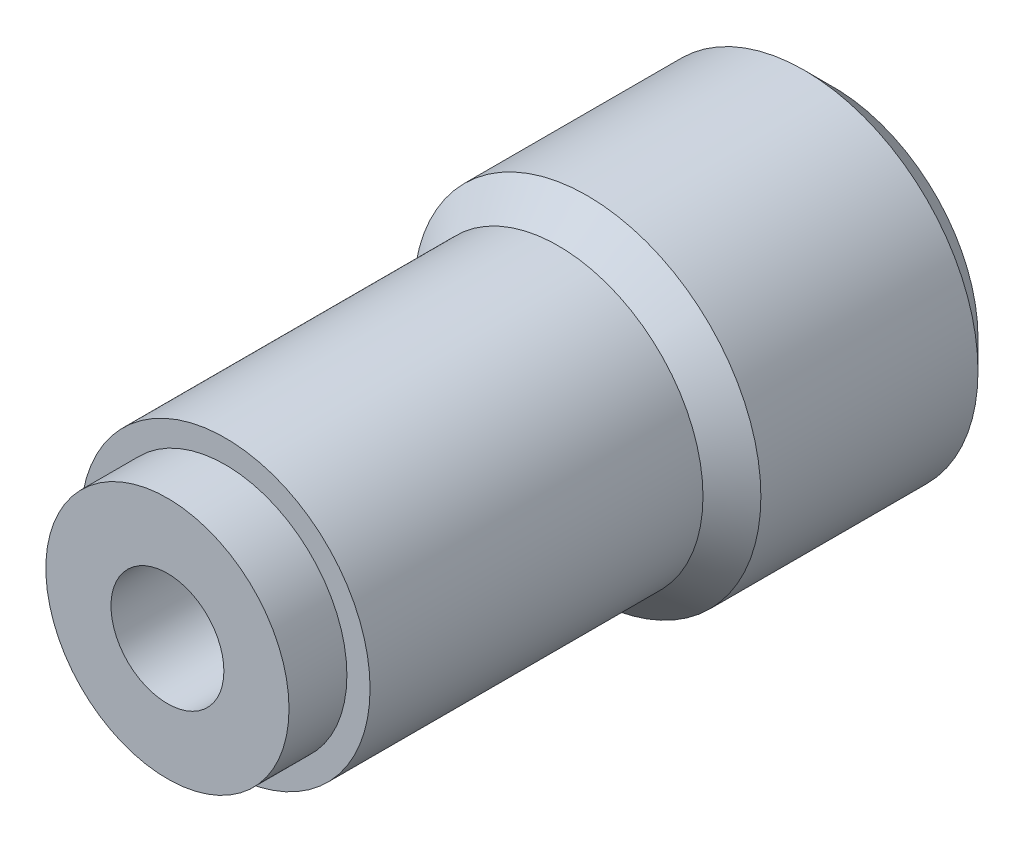
ISO-10303-21;
HEADER;
FILE_DESCRIPTION(('STEP AP214'),'2;1');
FILE_NAME('part.step','',(''),(''),'','','');
FILE_SCHEMA(('AUTOMOTIVE_DESIGN { 1 0 10303 214 1 1 1 1 }'));
ENDSEC;
DATA;
#1=APPLICATION_CONTEXT('core data for automotive mechanical design processes');
#2=APPLICATION_PROTOCOL_DEFINITION('international standard','automotive_design',2000,#1);
#3=PRODUCT_CONTEXT('',#1,'mechanical');
#4=PRODUCT('Part','Part','',(#3));
#5=PRODUCT_RELATED_PRODUCT_CATEGORY('part','',(#4));
#6=PRODUCT_DEFINITION_FORMATION('','',#4);
#7=PRODUCT_DEFINITION_CONTEXT('part definition',#1,'design');
#8=PRODUCT_DEFINITION('design','',#6,#7);
#9=PRODUCT_DEFINITION_SHAPE('','',#8);
#10=(LENGTH_UNIT() NAMED_UNIT(*) SI_UNIT(.MILLI.,.METRE.));
#11=(NAMED_UNIT(*) PLANE_ANGLE_UNIT() SI_UNIT($,.RADIAN.));
#12=(NAMED_UNIT(*) SI_UNIT($,.STERADIAN.) SOLID_ANGLE_UNIT());
#13=UNCERTAINTY_MEASURE_WITH_UNIT(LENGTH_MEASURE(1.E-05),#10,'distance_accuracy_value','');
#14=(GEOMETRIC_REPRESENTATION_CONTEXT(3) GLOBAL_UNCERTAINTY_ASSIGNED_CONTEXT((#13)) GLOBAL_UNIT_ASSIGNED_CONTEXT((#10,
#11,#12)) REPRESENTATION_CONTEXT('',''));
#15=CARTESIAN_POINT('',(0.,0.,0.));
#16=DIRECTION('',(0.,0.,1.));
#17=DIRECTION('',(1.,0.,0.));
#18=AXIS2_PLACEMENT_3D('',#15,#16,#17);
#19=CARTESIAN_POINT('',(0.,0.,15.));
#20=DIRECTION('',(0.,0.,1.));
#21=DIRECTION('',(1.,0.,0.));
#22=AXIS2_PLACEMENT_3D('',#19,#20,#21);
#23=PLANE('',#22);
#24=CARTESIAN_POINT('',(0.,0.,15.));
#25=DIRECTION('',(0.,0.,1.));
#26=DIRECTION('',(1.,0.,0.));
#27=AXIS2_PLACEMENT_3D('',#24,#25,#26);
#28=CIRCLE('',#27,1.95);
#29=CARTESIAN_POINT('',(1.95,0.,15.));
#30=VERTEX_POINT('',#29);
#31=EDGE_CURVE('E51',#30,#30,#28,.T.);
#32=ORIENTED_EDGE('',*,*,#31,.F.);
#33=EDGE_LOOP('',(#32));
#34=FACE_BOUND('',#33,.T.);
#35=CARTESIAN_POINT('',(0.,0.,15.));
#36=DIRECTION('',(0.,0.,1.));
#37=DIRECTION('',(1.,0.,0.));
#38=AXIS2_PLACEMENT_3D('',#35,#36,#37);
#39=CIRCLE('',#38,4.2);
#40=CARTESIAN_POINT('',(4.2,0.,15.));
#41=VERTEX_POINT('',#40);
#42=EDGE_CURVE('E67',#41,#41,#39,.T.);
#43=ORIENTED_EDGE('',*,*,#42,.T.);
#44=EDGE_LOOP('',(#43));
#45=FACE_BOUND('',#44,.T.);
#46=ADVANCED_FACE('F31',(#34,#45),#23,.T.);
#47=CARTESIAN_POINT('',(0.,0.,15.));
#48=DIRECTION('',(0.,0.,-1.));
#49=DIRECTION('',(-1.,0.,0.));
#50=AXIS2_PLACEMENT_3D('',#47,#48,#49);
#51=CYLINDRICAL_SURFACE('',#50,5.);
#52=CARTESIAN_POINT('',(0.,0.,1.50000000000003));
#53=DIRECTION('',(0.,0.,1.));
#54=DIRECTION('',(1.,0.,0.));
#55=AXIS2_PLACEMENT_3D('',#52,#53,#54);
#56=CIRCLE('',#55,5.);
#57=CARTESIAN_POINT('',(5.,0.,1.50000000000003));
#58=VERTEX_POINT('',#57);
#59=EDGE_CURVE('E46',#58,#58,#56,.T.);
#60=ORIENTED_EDGE('',*,*,#59,.T.);
#61=EDGE_LOOP('',(#60));
#62=FACE_BOUND('',#61,.T.);
#63=CARTESIAN_POINT('',(0.,0.,13.));
#64=DIRECTION('',(0.,0.,1.));
#65=DIRECTION('',(1.,0.,0.));
#66=AXIS2_PLACEMENT_3D('',#63,#64,#65);
#67=CIRCLE('',#66,5.);
#68=CARTESIAN_POINT('',(5.,0.,13.));
#69=VERTEX_POINT('',#68);
#70=EDGE_CURVE('E63',#69,#69,#67,.T.);
#71=ORIENTED_EDGE('',*,*,#70,.F.);
#72=EDGE_LOOP('',(#71));
#73=FACE_BOUND('',#72,.T.);
#74=ADVANCED_FACE('F82',(#62,#73),#51,.T.);
#75=CARTESIAN_POINT('',(0.,0.,15.));
#76=DIRECTION('',(0.,0.,-1.));
#77=DIRECTION('',(-1.,0.,0.));
#78=AXIS2_PLACEMENT_3D('',#75,#76,#77);
#79=CYLINDRICAL_SURFACE('',#78,1.95);
#80=CARTESIAN_POINT('',(0.,0.,4.));
#81=DIRECTION('',(0.,0.,1.));
#82=DIRECTION('',(1.,0.,0.));
#83=AXIS2_PLACEMENT_3D('',#80,#81,#82);
#84=CIRCLE('',#83,1.95);
#85=CARTESIAN_POINT('',(1.95,0.,4.));
#86=VERTEX_POINT('',#85);
#87=EDGE_CURVE('E52',#86,#86,#84,.T.);
#88=ORIENTED_EDGE('',*,*,#87,.F.);
#89=EDGE_LOOP('',(#88));
#90=FACE_BOUND('',#89,.T.);
#91=ORIENTED_EDGE('',*,*,#31,.T.);
#92=EDGE_LOOP('',(#91));
#93=FACE_BOUND('',#92,.T.);
#94=ADVANCED_FACE('F84',(#90,#93),#79,.F.);
#95=CARTESIAN_POINT('',(0.,0.,4.));
#96=DIRECTION('',(0.,0.,-1.));
#97=DIRECTION('',(-1.,0.,0.));
#98=AXIS2_PLACEMENT_3D('',#95,#96,#97);
#99=CYLINDRICAL_SURFACE('',#98,3.5);
#100=CARTESIAN_POINT('',(0.,0.,4.));
#101=DIRECTION('',(0.,0.,1.));
#102=DIRECTION('',(1.,0.,0.));
#103=AXIS2_PLACEMENT_3D('',#100,#101,#102);
#104=CIRCLE('',#103,3.5);
#105=CARTESIAN_POINT('',(3.5,0.,4.));
#106=VERTEX_POINT('',#105);
#107=EDGE_CURVE('E55',#106,#106,#104,.T.);
#108=ORIENTED_EDGE('',*,*,#107,.T.);
#109=EDGE_LOOP('',(#108));
#110=FACE_BOUND('',#109,.T.);
#111=CARTESIAN_POINT('',(0.,0.,-8.));
#112=DIRECTION('',(0.,0.,1.));
#113=DIRECTION('',(1.,0.,0.));
#114=AXIS2_PLACEMENT_3D('',#111,#112,#113);
#115=CIRCLE('',#114,3.5);
#116=CARTESIAN_POINT('',(3.5,0.,-8.));
#117=VERTEX_POINT('',#116);
#118=EDGE_CURVE('E60',#117,#117,#115,.T.);
#119=ORIENTED_EDGE('',*,*,#118,.F.);
#120=EDGE_LOOP('',(#119));
#121=FACE_BOUND('',#120,.T.);
#122=ADVANCED_FACE('F91',(#110,#121),#99,.F.);
#123=CARTESIAN_POINT('',(0.,0.,4.));
#124=DIRECTION('',(0.,0.,1.));
#125=DIRECTION('',(1.,0.,0.));
#126=AXIS2_PLACEMENT_3D('',#123,#124,#125);
#127=PLANE('',#126);
#128=ORIENTED_EDGE('',*,*,#87,.T.);
#129=EDGE_LOOP('',(#128));
#130=FACE_BOUND('',#129,.T.);
#131=ORIENTED_EDGE('',*,*,#107,.F.);
#132=EDGE_LOOP('',(#131));
#133=FACE_BOUND('',#132,.T.);
#134=ADVANCED_FACE('F112',(#130,#133),#127,.F.);
#135=CARTESIAN_POINT('',(0.,0.,-8.));
#136=DIRECTION('',(0.,0.,1.));
#137=DIRECTION('',(1.,0.,0.));
#138=AXIS2_PLACEMENT_3D('',#135,#136,#137);
#139=CYLINDRICAL_SURFACE('',#138,6.);
#140=CARTESIAN_POINT('',(0.,0.,-7.));
#141=DIRECTION('',(0.,0.,1.));
#142=DIRECTION('',(1.,0.,0.));
#143=AXIS2_PLACEMENT_3D('',#140,#141,#142);
#144=CIRCLE('',#143,6.);
#145=CARTESIAN_POINT('',(6.,0.,-7.));
#146=VERTEX_POINT('',#145);
#147=EDGE_CURVE('E38',#146,#146,#144,.T.);
#148=ORIENTED_EDGE('',*,*,#147,.T.);
#149=EDGE_LOOP('',(#148));
#150=FACE_BOUND('',#149,.T.);
#151=CARTESIAN_POINT('',(0.,0.,0.500000000000015));
#152=DIRECTION('',(0.,0.,-1.));
#153=DIRECTION('',(-1.,0.,0.));
#154=AXIS2_PLACEMENT_3D('',#151,#152,#153);
#155=CIRCLE('',#154,6.);
#156=CARTESIAN_POINT('',(-6.,0.,0.500000000000015));
#157=VERTEX_POINT('',#156);
#158=EDGE_CURVE('E42',#157,#157,#155,.T.);
#159=ORIENTED_EDGE('',*,*,#158,.T.);
#160=EDGE_LOOP('',(#159));
#161=FACE_BOUND('',#160,.T.);
#162=ADVANCED_FACE('F105',(#150,#161),#139,.T.);
#163=CARTESIAN_POINT('',(0.,0.,-8.));
#164=DIRECTION('',(0.,0.,1.));
#165=DIRECTION('',(1.,0.,0.));
#166=AXIS2_PLACEMENT_3D('',#163,#164,#165);
#167=PLANE('',#166);
#168=CARTESIAN_POINT('',(0.,0.,-8.));
#169=DIRECTION('',(0.,0.,1.));
#170=DIRECTION('',(1.,0.,0.));
#171=AXIS2_PLACEMENT_3D('',#168,#169,#170);
#172=CIRCLE('',#171,5.);
#173=CARTESIAN_POINT('',(5.,0.,-8.));
#174=VERTEX_POINT('',#173);
#175=EDGE_CURVE('E10',#174,#174,#172,.F.);
#176=ORIENTED_EDGE('',*,*,#175,.T.);
#177=EDGE_LOOP('',(#176));
#178=FACE_BOUND('',#177,.T.);
#179=ORIENTED_EDGE('',*,*,#118,.T.);
#180=EDGE_LOOP('',(#179));
#181=FACE_BOUND('',#180,.T.);
#182=ADVANCED_FACE('F98',(#178,#181),#167,.F.);
#183=CARTESIAN_POINT('',(0.,0.,1.50000000000003));
#184=DIRECTION('',(0.,0.,-1.));
#185=DIRECTION('',(-1.,0.,0.));
#186=AXIS2_PLACEMENT_3D('',#183,#184,#185);
#187=CONICAL_SURFACE('',#186,5.,0.785398163397443);
#188=ORIENTED_EDGE('',*,*,#158,.F.);
#189=EDGE_LOOP('',(#188));
#190=FACE_BOUND('',#189,.T.);
#191=ORIENTED_EDGE('',*,*,#59,.F.);
#192=EDGE_LOOP('',(#191));
#193=FACE_BOUND('',#192,.T.);
#194=ADVANCED_FACE('F96',(#190,#193),#187,.T.);
#195=CARTESIAN_POINT('',(0.,0.,-7.));
#196=DIRECTION('',(0.,0.,1.));
#197=DIRECTION('',(1.,0.,0.));
#198=AXIS2_PLACEMENT_3D('',#195,#196,#197);
#199=CONICAL_SURFACE('',#198,6.,0.78539816339745);
#200=ORIENTED_EDGE('',*,*,#175,.F.);
#201=EDGE_LOOP('',(#200));
#202=FACE_BOUND('',#201,.T.);
#203=ORIENTED_EDGE('',*,*,#147,.F.);
#204=EDGE_LOOP('',(#203));
#205=FACE_BOUND('',#204,.T.);
#206=ADVANCED_FACE('F33',(#202,#205),#199,.T.);
#207=CARTESIAN_POINT('',(0.,0.,13.));
#208=DIRECTION('',(0.,0.,1.));
#209=DIRECTION('',(1.,0.,0.));
#210=AXIS2_PLACEMENT_3D('',#207,#208,#209);
#211=PLANE('',#210);
#212=CARTESIAN_POINT('',(0.,0.,13.));
#213=DIRECTION('',(0.,0.,1.));
#214=DIRECTION('',(1.,0.,0.));
#215=AXIS2_PLACEMENT_3D('',#212,#213,#214);
#216=CIRCLE('',#215,4.2);
#217=CARTESIAN_POINT('',(4.2,0.,13.));
#218=VERTEX_POINT('',#217);
#219=EDGE_CURVE('E66',#218,#218,#216,.T.);
#220=ORIENTED_EDGE('',*,*,#219,.F.);
#221=EDGE_LOOP('',(#220));
#222=FACE_BOUND('',#221,.T.);
#223=ORIENTED_EDGE('',*,*,#70,.T.);
#224=EDGE_LOOP('',(#223));
#225=FACE_BOUND('',#224,.T.);
#226=ADVANCED_FACE('F76',(#222,#225),#211,.T.);
#227=CARTESIAN_POINT('',(0.,0.,13.));
#228=DIRECTION('',(0.,0.,1.));
#229=DIRECTION('',(1.,0.,0.));
#230=AXIS2_PLACEMENT_3D('',#227,#228,#229);
#231=CYLINDRICAL_SURFACE('',#230,4.2);
#232=ORIENTED_EDGE('',*,*,#219,.T.);
#233=EDGE_LOOP('',(#232));
#234=FACE_BOUND('',#233,.T.);
#235=ORIENTED_EDGE('',*,*,#42,.F.);
#236=EDGE_LOOP('',(#235));
#237=FACE_BOUND('',#236,.T.);
#238=ADVANCED_FACE('F73',(#234,#237),#231,.T.);
#239=CLOSED_SHELL('',(#46,#74,#94,#122,#134,#162,#182,#194,#206,#226,#238));
#240=MANIFOLD_SOLID_BREP('B2',#239);
#241=ADVANCED_BREP_SHAPE_REPRESENTATION('',(#18,#240),#14);
#242=SHAPE_DEFINITION_REPRESENTATION(#9,#241);
ENDSEC;
END-ISO-10303-21;
